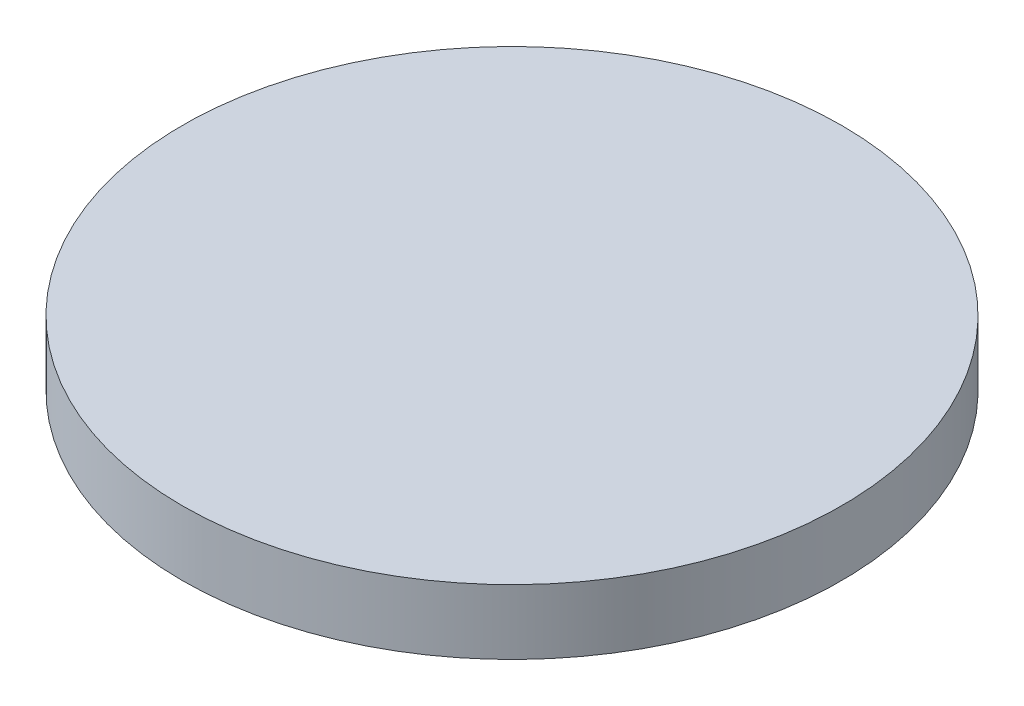
ISO-10303-21;
HEADER;
FILE_DESCRIPTION(('STEP AP214'),'2;1');
FILE_NAME('part.step','',(''),(''),'','','');
FILE_SCHEMA(('AUTOMOTIVE_DESIGN { 1 0 10303 214 1 1 1 1 }'));
ENDSEC;
DATA;
#1=APPLICATION_CONTEXT('core data for automotive mechanical design processes');
#2=APPLICATION_PROTOCOL_DEFINITION('international standard','automotive_design',2000,#1);
#3=PRODUCT_CONTEXT('',#1,'mechanical');
#4=PRODUCT('Part','Part','',(#3));
#5=PRODUCT_RELATED_PRODUCT_CATEGORY('part','',(#4));
#6=PRODUCT_DEFINITION_FORMATION('','',#4);
#7=PRODUCT_DEFINITION_CONTEXT('part definition',#1,'design');
#8=PRODUCT_DEFINITION('design','',#6,#7);
#9=PRODUCT_DEFINITION_SHAPE('','',#8);
#10=(LENGTH_UNIT() NAMED_UNIT(*) SI_UNIT(.MILLI.,.METRE.));
#11=(NAMED_UNIT(*) PLANE_ANGLE_UNIT() SI_UNIT($,.RADIAN.));
#12=(NAMED_UNIT(*) SI_UNIT($,.STERADIAN.) SOLID_ANGLE_UNIT());
#13=UNCERTAINTY_MEASURE_WITH_UNIT(LENGTH_MEASURE(1.E-05),#10,'distance_accuracy_value','');
#14=(GEOMETRIC_REPRESENTATION_CONTEXT(3) GLOBAL_UNCERTAINTY_ASSIGNED_CONTEXT((#13)) GLOBAL_UNIT_ASSIGNED_CONTEXT((#10,
#11,#12)) REPRESENTATION_CONTEXT('',''));
#15=CARTESIAN_POINT('',(0.,0.,0.));
#16=DIRECTION('',(0.,0.,1.));
#17=DIRECTION('',(1.,0.,0.));
#18=AXIS2_PLACEMENT_3D('',#15,#16,#17);
#19=CARTESIAN_POINT('',(0.,1.3,0.));
#20=DIRECTION('',(0.,-1.,0.));
#21=DIRECTION('',(0.,0.,-1.));
#22=AXIS2_PLACEMENT_3D('',#19,#20,#21);
#23=CYLINDRICAL_SURFACE('',#22,15.);
#24=CARTESIAN_POINT('',(0.,1.3,0.));
#25=DIRECTION('',(0.,1.,0.));
#26=DIRECTION('',(0.,0.,1.));
#27=AXIS2_PLACEMENT_3D('',#24,#25,#26);
#28=CIRCLE('',#27,15.);
#29=CARTESIAN_POINT('',(0.,1.3,15.));
#30=VERTEX_POINT('',#29);
#31=EDGE_CURVE('E52',#30,#30,#28,.T.);
#32=ORIENTED_EDGE('',*,*,#31,.F.);
#33=EDGE_LOOP('',(#32));
#34=FACE_BOUND('',#33,.T.);
#35=CARTESIAN_POINT('',(0.,-1.65,0.));
#36=DIRECTION('',(0.,1.,0.));
#37=DIRECTION('',(0.,0.,1.));
#38=AXIS2_PLACEMENT_3D('',#35,#36,#37);
#39=CIRCLE('',#38,15.);
#40=CARTESIAN_POINT('',(0.,-1.65,15.));
#41=VERTEX_POINT('',#40);
#42=EDGE_CURVE('E57',#41,#41,#39,.T.);
#43=ORIENTED_EDGE('',*,*,#42,.T.);
#44=EDGE_LOOP('',(#43));
#45=FACE_BOUND('',#44,.T.);
#46=ADVANCED_FACE('F45',(#34,#45),#23,.T.);
#47=CARTESIAN_POINT('',(0.,1.3,0.));
#48=DIRECTION('',(0.,1.,0.));
#49=DIRECTION('',(0.,0.,1.));
#50=AXIS2_PLACEMENT_3D('',#47,#48,#49);
#51=PLANE('',#50);
#52=ORIENTED_EDGE('',*,*,#31,.T.);
#53=EDGE_LOOP('',(#52));
#54=FACE_BOUND('',#53,.T.);
#55=ADVANCED_FACE('F81',(#54),#51,.T.);
#56=CARTESIAN_POINT('',(0.,-1.65,0.));
#57=DIRECTION('',(0.,1.,0.));
#58=DIRECTION('',(0.,0.,1.));
#59=AXIS2_PLACEMENT_3D('',#56,#57,#58);
#60=PLANE('',#59);
#61=CARTESIAN_POINT('',(0.,-1.65,0.));
#62=DIRECTION('',(0.,1.,0.));
#63=DIRECTION('',(0.,0.,1.));
#64=AXIS2_PLACEMENT_3D('',#61,#62,#63);
#65=CIRCLE('',#64,10.75);
#66=CARTESIAN_POINT('',(0.,-1.65,10.75));
#67=VERTEX_POINT('',#66);
#68=EDGE_CURVE('E62',#67,#67,#65,.T.);
#69=ORIENTED_EDGE('',*,*,#68,.T.);
#70=EDGE_LOOP('',(#69));
#71=FACE_BOUND('',#70,.T.);
#72=ORIENTED_EDGE('',*,*,#42,.F.);
#73=EDGE_LOOP('',(#72));
#74=FACE_BOUND('',#73,.T.);
#75=ADVANCED_FACE('F69',(#71,#74),#60,.F.);
#76=CARTESIAN_POINT('',(0.,-1.65,0.));
#77=DIRECTION('',(0.,1.,0.));
#78=DIRECTION('',(0.,0.,1.));
#79=AXIS2_PLACEMENT_3D('',#76,#77,#78);
#80=CYLINDRICAL_SURFACE('',#79,10.75);
#81=ORIENTED_EDGE('',*,*,#68,.F.);
#82=EDGE_LOOP('',(#81));
#83=FACE_BOUND('',#82,.T.);
#84=CARTESIAN_POINT('',(0.,0.,0.));
#85=DIRECTION('',(0.,1.,0.));
#86=DIRECTION('',(0.,0.,1.));
#87=AXIS2_PLACEMENT_3D('',#84,#85,#86);
#88=CIRCLE('',#87,10.75);
#89=CARTESIAN_POINT('',(0.,0.,10.75));
#90=VERTEX_POINT('',#89);
#91=EDGE_CURVE('E11',#90,#90,#88,.T.);
#92=ORIENTED_EDGE('',*,*,#91,.T.);
#93=EDGE_LOOP('',(#92));
#94=FACE_BOUND('',#93,.T.);
#95=ADVANCED_FACE('F72',(#83,#94),#80,.F.);
#96=CARTESIAN_POINT('',(0.,0.,0.));
#97=DIRECTION('',(0.,1.,0.));
#98=DIRECTION('',(0.,0.,1.));
#99=AXIS2_PLACEMENT_3D('',#96,#97,#98);
#100=PLANE('',#99);
#101=ORIENTED_EDGE('',*,*,#91,.F.);
#102=EDGE_LOOP('',(#101));
#103=FACE_BOUND('',#102,.T.);
#104=ADVANCED_FACE('F74',(#103),#100,.F.);
#105=CLOSED_SHELL('',(#46,#55,#75,#95,#104));
#106=MANIFOLD_SOLID_BREP('B2',#105);
#107=ADVANCED_BREP_SHAPE_REPRESENTATION('',(#18,#106),#14);
#108=SHAPE_DEFINITION_REPRESENTATION(#9,#107);
ENDSEC;
END-ISO-10303-21;
